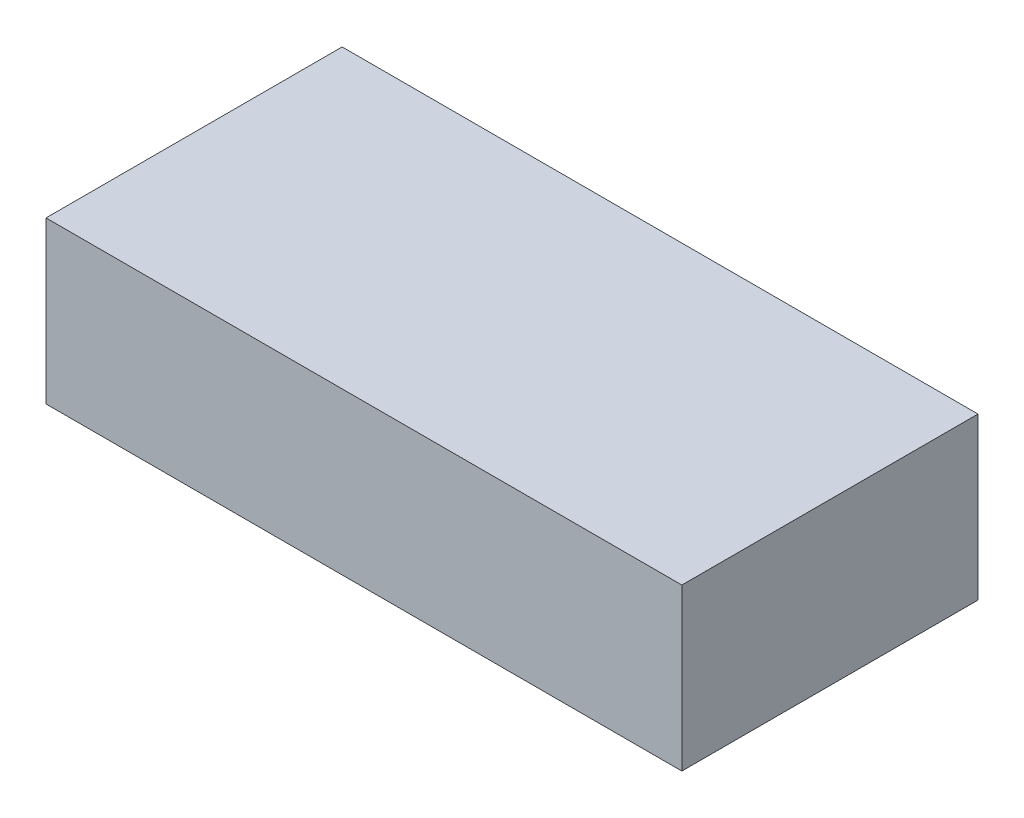
ISO-10303-21;
HEADER;
FILE_DESCRIPTION(('STEP AP214'),'2;1');
FILE_NAME('part.step','',(''),(''),'','','');
FILE_SCHEMA(('AUTOMOTIVE_DESIGN { 1 0 10303 214 1 1 1 1 }'));
ENDSEC;
DATA;
#1=APPLICATION_CONTEXT('core data for automotive mechanical design processes');
#2=APPLICATION_PROTOCOL_DEFINITION('international standard','automotive_design',2000,#1);
#3=PRODUCT_CONTEXT('',#1,'mechanical');
#4=PRODUCT('Part','Part','',(#3));
#5=PRODUCT_RELATED_PRODUCT_CATEGORY('part','',(#4));
#6=PRODUCT_DEFINITION_FORMATION('','',#4);
#7=PRODUCT_DEFINITION_CONTEXT('part definition',#1,'design');
#8=PRODUCT_DEFINITION('design','',#6,#7);
#9=PRODUCT_DEFINITION_SHAPE('','',#8);
#10=(LENGTH_UNIT() NAMED_UNIT(*) SI_UNIT(.MILLI.,.METRE.));
#11=(NAMED_UNIT(*) PLANE_ANGLE_UNIT() SI_UNIT($,.RADIAN.));
#12=(NAMED_UNIT(*) SI_UNIT($,.STERADIAN.) SOLID_ANGLE_UNIT());
#13=UNCERTAINTY_MEASURE_WITH_UNIT(LENGTH_MEASURE(1.E-05),#10,'distance_accuracy_value','');
#14=(GEOMETRIC_REPRESENTATION_CONTEXT(3) GLOBAL_UNCERTAINTY_ASSIGNED_CONTEXT((#13)) GLOBAL_UNIT_ASSIGNED_CONTEXT((#10,
#11,#12)) REPRESENTATION_CONTEXT('',''));
#15=CARTESIAN_POINT('',(0.,0.,0.));
#16=DIRECTION('',(0.,0.,1.));
#17=DIRECTION('',(1.,0.,0.));
#18=AXIS2_PLACEMENT_3D('',#15,#16,#17);
#19=CARTESIAN_POINT('',(36.5,18.5,17.));
#20=DIRECTION('',(-1.,0.,0.));
#21=DIRECTION('',(0.,0.,1.));
#22=AXIS2_PLACEMENT_3D('',#19,#20,#21);
#23=PLANE('',#22);
#24=DIRECTION('',(0.,0.,-1.));
#25=VECTOR('',#24,1.);
#26=CARTESIAN_POINT('',(36.5,0.,17.));
#27=LINE('',#26,#25);
#28=CARTESIAN_POINT('',(36.5,0.,17.));
#29=VERTEX_POINT('',#28);
#30=CARTESIAN_POINT('',(36.5,0.,-17.));
#31=VERTEX_POINT('',#30);
#32=EDGE_CURVE('E105',#29,#31,#27,.T.);
#33=ORIENTED_EDGE('',*,*,#32,.T.);
#34=DIRECTION('',(0.,-1.,0.));
#35=VECTOR('',#34,1.);
#36=CARTESIAN_POINT('',(36.5,18.5,-17.));
#37=LINE('',#36,#35);
#38=CARTESIAN_POINT('',(36.5,18.5,-17.));
#39=VERTEX_POINT('',#38);
#40=EDGE_CURVE('E11',#39,#31,#37,.T.);
#41=ORIENTED_EDGE('',*,*,#40,.F.);
#42=DIRECTION('',(0.,0.,-1.));
#43=VECTOR('',#42,1.);
#44=CARTESIAN_POINT('',(36.5,18.5,17.));
#45=LINE('',#44,#43);
#46=CARTESIAN_POINT('',(36.5,18.5,17.));
#47=VERTEX_POINT('',#46);
#48=EDGE_CURVE('E89',#47,#39,#45,.T.);
#49=ORIENTED_EDGE('',*,*,#48,.F.);
#50=DIRECTION('',(0.,-1.,0.));
#51=VECTOR('',#50,1.);
#52=CARTESIAN_POINT('',(36.5,18.5,17.));
#53=LINE('',#52,#51);
#54=EDGE_CURVE('E97',#47,#29,#53,.T.);
#55=ORIENTED_EDGE('',*,*,#54,.T.);
#56=EDGE_LOOP('',(#33,#41,#49,#55));
#57=FACE_BOUND('',#56,.T.);
#58=ADVANCED_FACE('F39',(#57),#23,.F.);
#59=CARTESIAN_POINT('',(-36.5,18.5,-17.));
#60=DIRECTION('',(0.,0.,1.));
#61=DIRECTION('',(1.,0.,0.));
#62=AXIS2_PLACEMENT_3D('',#59,#60,#61);
#63=PLANE('',#62);
#64=DIRECTION('',(-1.,0.,0.));
#65=VECTOR('',#64,1.);
#66=CARTESIAN_POINT('',(-36.5,0.,-17.));
#67=LINE('',#66,#65);
#68=CARTESIAN_POINT('',(-36.5,0.,-17.));
#69=VERTEX_POINT('',#68);
#70=EDGE_CURVE('E92',#31,#69,#67,.T.);
#71=ORIENTED_EDGE('',*,*,#70,.T.);
#72=DIRECTION('',(0.,-1.,0.));
#73=VECTOR('',#72,1.);
#74=CARTESIAN_POINT('',(-36.5,18.5,-17.));
#75=LINE('',#74,#73);
#76=CARTESIAN_POINT('',(-36.5,18.5,-17.));
#77=VERTEX_POINT('',#76);
#78=EDGE_CURVE('E50',#77,#69,#75,.T.);
#79=ORIENTED_EDGE('',*,*,#78,.F.);
#80=DIRECTION('',(-1.,0.,0.));
#81=VECTOR('',#80,1.);
#82=CARTESIAN_POINT('',(-36.5,18.5,-17.));
#83=LINE('',#82,#81);
#84=EDGE_CURVE('E82',#39,#77,#83,.T.);
#85=ORIENTED_EDGE('',*,*,#84,.F.);
#86=ORIENTED_EDGE('',*,*,#40,.T.);
#87=EDGE_LOOP('',(#71,#79,#85,#86));
#88=FACE_BOUND('',#87,.T.);
#89=ADVANCED_FACE('F93',(#88),#63,.F.);
#90=CARTESIAN_POINT('',(-36.5,18.5,17.));
#91=DIRECTION('',(1.,0.,0.));
#92=DIRECTION('',(0.,0.,-1.));
#93=AXIS2_PLACEMENT_3D('',#90,#91,#92);
#94=PLANE('',#93);
#95=DIRECTION('',(0.,0.,1.));
#96=VECTOR('',#95,1.);
#97=CARTESIAN_POINT('',(-36.5,0.,17.));
#98=LINE('',#97,#96);
#99=CARTESIAN_POINT('',(-36.5,0.,17.));
#100=VERTEX_POINT('',#99);
#101=EDGE_CURVE('E75',#69,#100,#98,.T.);
#102=ORIENTED_EDGE('',*,*,#101,.T.);
#103=DIRECTION('',(0.,-1.,0.));
#104=VECTOR('',#103,1.);
#105=CARTESIAN_POINT('',(-36.5,18.5,17.));
#106=LINE('',#105,#104);
#107=CARTESIAN_POINT('',(-36.5,18.5,17.));
#108=VERTEX_POINT('',#107);
#109=EDGE_CURVE('E94',#108,#100,#106,.T.);
#110=ORIENTED_EDGE('',*,*,#109,.F.);
#111=DIRECTION('',(0.,0.,1.));
#112=VECTOR('',#111,1.);
#113=CARTESIAN_POINT('',(-36.5,18.5,17.));
#114=LINE('',#113,#112);
#115=EDGE_CURVE('E88',#77,#108,#114,.T.);
#116=ORIENTED_EDGE('',*,*,#115,.F.);
#117=ORIENTED_EDGE('',*,*,#78,.T.);
#118=EDGE_LOOP('',(#102,#110,#116,#117));
#119=FACE_BOUND('',#118,.T.);
#120=ADVANCED_FACE('F96',(#119),#94,.F.);
#121=CARTESIAN_POINT('',(-36.5,18.5,17.));
#122=DIRECTION('',(0.,0.,-1.));
#123=DIRECTION('',(-1.,0.,0.));
#124=AXIS2_PLACEMENT_3D('',#121,#122,#123);
#125=PLANE('',#124);
#126=DIRECTION('',(1.,0.,0.));
#127=VECTOR('',#126,1.);
#128=CARTESIAN_POINT('',(-36.5,0.,17.));
#129=LINE('',#128,#127);
#130=EDGE_CURVE('E76',#100,#29,#129,.T.);
#131=ORIENTED_EDGE('',*,*,#130,.T.);
#132=ORIENTED_EDGE('',*,*,#54,.F.);
#133=DIRECTION('',(1.,0.,0.));
#134=VECTOR('',#133,1.);
#135=CARTESIAN_POINT('',(-36.5,18.5,17.));
#136=LINE('',#135,#134);
#137=EDGE_CURVE('E54',#108,#47,#136,.T.);
#138=ORIENTED_EDGE('',*,*,#137,.F.);
#139=ORIENTED_EDGE('',*,*,#109,.T.);
#140=EDGE_LOOP('',(#131,#132,#138,#139));
#141=FACE_BOUND('',#140,.T.);
#142=ADVANCED_FACE('F109',(#141),#125,.F.);
#143=CARTESIAN_POINT('',(0.,18.5,0.));
#144=DIRECTION('',(0.,-1.,0.));
#145=DIRECTION('',(0.,0.,-1.));
#146=AXIS2_PLACEMENT_3D('',#143,#144,#145);
#147=PLANE('',#146);
#148=ORIENTED_EDGE('',*,*,#48,.T.);
#149=ORIENTED_EDGE('',*,*,#84,.T.);
#150=ORIENTED_EDGE('',*,*,#115,.T.);
#151=ORIENTED_EDGE('',*,*,#137,.T.);
#152=EDGE_LOOP('',(#148,#149,#150,#151));
#153=FACE_BOUND('',#152,.T.);
#154=ADVANCED_FACE('F86',(#153),#147,.F.);
#155=CARTESIAN_POINT('',(0.,0.,0.));
#156=DIRECTION('',(0.,-1.,0.));
#157=DIRECTION('',(0.,0.,-1.));
#158=AXIS2_PLACEMENT_3D('',#155,#156,#157);
#159=PLANE('',#158);
#160=ORIENTED_EDGE('',*,*,#32,.F.);
#161=ORIENTED_EDGE('',*,*,#130,.F.);
#162=ORIENTED_EDGE('',*,*,#101,.F.);
#163=ORIENTED_EDGE('',*,*,#70,.F.);
#164=EDGE_LOOP('',(#160,#161,#162,#163));
#165=FACE_BOUND('',#164,.T.);
#166=ADVANCED_FACE('F115',(#165),#159,.T.);
#167=CLOSED_SHELL('',(#58,#89,#120,#142,#154,#166));
#168=MANIFOLD_SOLID_BREP('B2',#167);
#169=ADVANCED_BREP_SHAPE_REPRESENTATION('',(#18,#168),#14);
#170=SHAPE_DEFINITION_REPRESENTATION(#9,#169);
ENDSEC;
END-ISO-10303-21;
